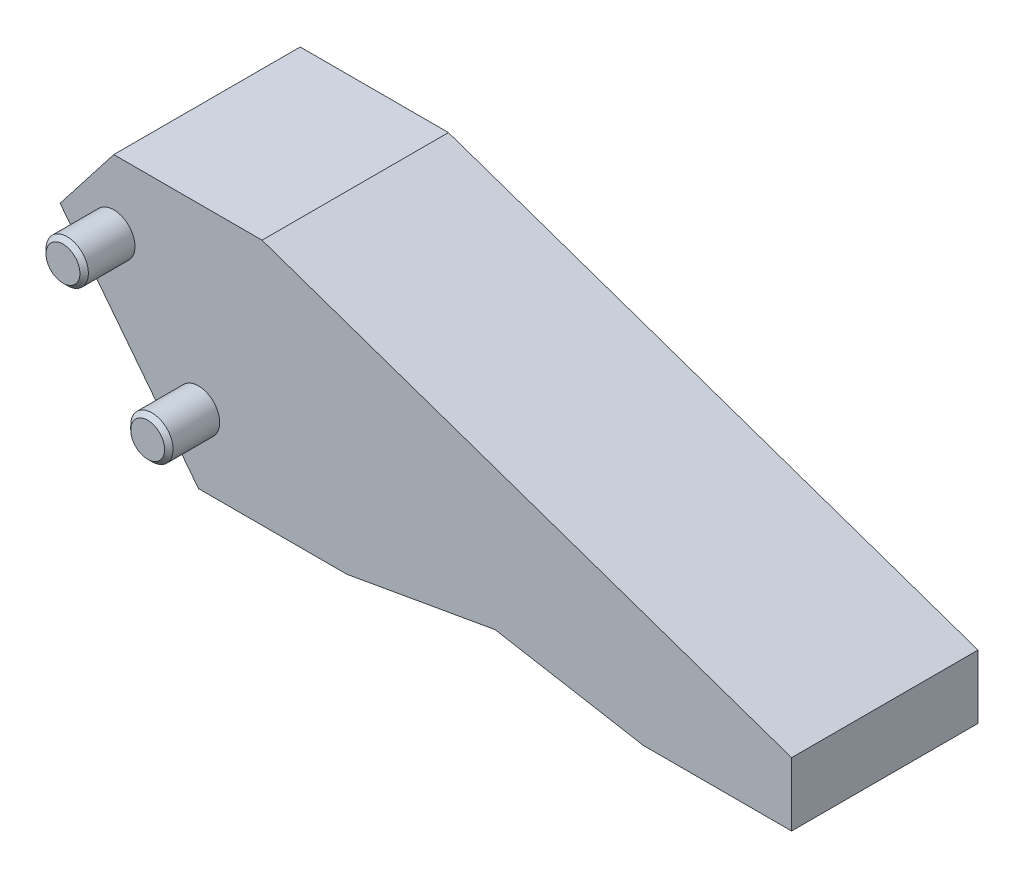
ISO-10303-21;
HEADER;
FILE_DESCRIPTION(('STEP AP214'),'2;1');
FILE_NAME('part.step','',(''),(''),'','','');
FILE_SCHEMA(('AUTOMOTIVE_DESIGN { 1 0 10303 214 1 1 1 1 }'));
ENDSEC;
DATA;
#1=APPLICATION_CONTEXT('core data for automotive mechanical design processes');
#2=APPLICATION_PROTOCOL_DEFINITION('international standard','automotive_design',2000,#1);
#3=PRODUCT_CONTEXT('',#1,'mechanical');
#4=PRODUCT('Part','Part','',(#3));
#5=PRODUCT_RELATED_PRODUCT_CATEGORY('part','',(#4));
#6=PRODUCT_DEFINITION_FORMATION('','',#4);
#7=PRODUCT_DEFINITION_CONTEXT('part definition',#1,'design');
#8=PRODUCT_DEFINITION('design','',#6,#7);
#9=PRODUCT_DEFINITION_SHAPE('','',#8);
#10=(LENGTH_UNIT() NAMED_UNIT(*) SI_UNIT(.MILLI.,.METRE.));
#11=(NAMED_UNIT(*) PLANE_ANGLE_UNIT() SI_UNIT($,.RADIAN.));
#12=(NAMED_UNIT(*) SI_UNIT($,.STERADIAN.) SOLID_ANGLE_UNIT());
#13=UNCERTAINTY_MEASURE_WITH_UNIT(LENGTH_MEASURE(1.E-05),#10,'distance_accuracy_value','');
#14=(GEOMETRIC_REPRESENTATION_CONTEXT(3) GLOBAL_UNCERTAINTY_ASSIGNED_CONTEXT((#13)) GLOBAL_UNIT_ASSIGNED_CONTEXT((#10,
#11,#12)) REPRESENTATION_CONTEXT('',''));
#15=CARTESIAN_POINT('',(0.,0.,0.));
#16=DIRECTION('',(0.,0.,1.));
#17=DIRECTION('',(1.,0.,0.));
#18=AXIS2_PLACEMENT_3D('',#15,#16,#17);
#19=CARTESIAN_POINT('',(-12.6689495444044,0.,22.));
#20=DIRECTION('',(0.,0.,1.));
#21=DIRECTION('',(1.,0.,0.));
#22=AXIS2_PLACEMENT_3D('',#19,#20,#21);
#23=PLANE('',#22);
#24=CARTESIAN_POINT('',(0.,0.,22.));
#25=DIRECTION('',(0.,0.,1.));
#26=DIRECTION('',(1.,0.,0.));
#27=AXIS2_PLACEMENT_3D('',#24,#25,#26);
#28=CIRCLE('',#27,5.);
#29=CARTESIAN_POINT('',(5.,0.,22.));
#30=VERTEX_POINT('',#29);
#31=EDGE_CURVE('E128',#30,#30,#28,.T.);
#32=ORIENTED_EDGE('',*,*,#31,.F.);
#33=EDGE_LOOP('',(#32));
#34=FACE_BOUND('',#33,.T.);
#35=DIRECTION('',(-0.613967345345676,-0.789331425225921,0.));
#36=VECTOR('',#35,1.);
#37=CARTESIAN_POINT('',(-12.6689495444044,0.,22.));
#38=LINE('',#37,#36);
#39=CARTESIAN_POINT('',(0.,16.2875111776015,22.));
#40=VERTEX_POINT('',#39);
#41=CARTESIAN_POINT('',(-12.6689495444044,0.,22.));
#42=VERTEX_POINT('',#41);
#43=EDGE_CURVE('E148',#40,#42,#38,.T.);
#44=ORIENTED_EDGE('',*,*,#43,.T.);
#45=DIRECTION('',(0.613967345345677,-0.78933142522592,0.));
#46=VECTOR('',#45,1.);
#47=CARTESIAN_POINT('',(20.,-42.,22.));
#48=LINE('',#47,#46);
#49=CARTESIAN_POINT('',(20.,-42.,22.));
#50=VERTEX_POINT('',#49);
#51=EDGE_CURVE('E120',#42,#50,#48,.T.);
#52=ORIENTED_EDGE('',*,*,#51,.T.);
#53=DIRECTION('',(1.,0.,0.));
#54=VECTOR('',#53,1.);
#55=CARTESIAN_POINT('',(55.,-42.,22.));
#56=LINE('',#55,#54);
#57=CARTESIAN_POINT('',(55.,-42.,22.));
#58=VERTEX_POINT('',#57);
#59=EDGE_CURVE('E151',#50,#58,#56,.T.);
#60=ORIENTED_EDGE('',*,*,#59,.T.);
#61=DIRECTION('',(0.984807753012208,0.173648177666931,0.));
#62=VECTOR('',#61,1.);
#63=CARTESIAN_POINT('',(90.,-35.8285556752037,22.));
#64=LINE('',#63,#62);
#65=CARTESIAN_POINT('',(90.,-35.8285556752037,22.));
#66=VERTEX_POINT('',#65);
#67=EDGE_CURVE('E153',#58,#66,#64,.T.);
#68=ORIENTED_EDGE('',*,*,#67,.T.);
#69=DIRECTION('',(0.984807753012208,-0.173648177666931,0.));
#70=VECTOR('',#69,1.);
#71=CARTESIAN_POINT('',(125.,-42.,22.));
#72=LINE('',#71,#70);
#73=CARTESIAN_POINT('',(125.,-42.,22.));
#74=VERTEX_POINT('',#73);
#75=EDGE_CURVE('E155',#66,#74,#72,.T.);
#76=ORIENTED_EDGE('',*,*,#75,.T.);
#77=DIRECTION('',(1.,0.,0.));
#78=VECTOR('',#77,1.);
#79=CARTESIAN_POINT('',(160.,-42.,22.));
#80=LINE('',#79,#78);
#81=CARTESIAN_POINT('',(160.,-42.,22.));
#82=VERTEX_POINT('',#81);
#83=EDGE_CURVE('E157',#74,#82,#80,.T.);
#84=ORIENTED_EDGE('',*,*,#83,.T.);
#85=DIRECTION('',(0.,1.,0.));
#86=VECTOR('',#85,1.);
#87=CARTESIAN_POINT('',(160.,-27.,22.));
#88=LINE('',#87,#86);
#89=CARTESIAN_POINT('',(160.,-27.,22.));
#90=VERTEX_POINT('',#89);
#91=EDGE_CURVE('E159',#82,#90,#88,.T.);
#92=ORIENTED_EDGE('',*,*,#91,.T.);
#93=DIRECTION('',(-0.944943348295466,0.327233966012321,0.));
#94=VECTOR('',#93,1.);
#95=CARTESIAN_POINT('',(35.,16.2875111776015,22.));
#96=LINE('',#95,#94);
#97=CARTESIAN_POINT('',(35.,16.2875111776015,22.));
#98=VERTEX_POINT('',#97);
#99=EDGE_CURVE('E53',#90,#98,#96,.T.);
#100=ORIENTED_EDGE('',*,*,#99,.T.);
#101=DIRECTION('',(-1.,0.,0.));
#102=VECTOR('',#101,1.);
#103=CARTESIAN_POINT('',(0.,16.2875111776015,22.));
#104=LINE('',#103,#102);
#105=EDGE_CURVE('E48',#98,#40,#104,.T.);
#106=ORIENTED_EDGE('',*,*,#105,.T.);
#107=EDGE_LOOP('',(#44,#52,#60,#68,#76,#84,#92,#100,#106));
#108=FACE_BOUND('',#107,.T.);
#109=CARTESIAN_POINT('',(20.,-26.,22.));
#110=DIRECTION('',(0.,0.,1.));
#111=DIRECTION('',(1.,0.,0.));
#112=AXIS2_PLACEMENT_3D('',#109,#110,#111);
#113=CIRCLE('',#112,5.);
#114=CARTESIAN_POINT('',(25.,-26.,22.));
#115=VERTEX_POINT('',#114);
#116=EDGE_CURVE('E131',#115,#115,#113,.T.);
#117=ORIENTED_EDGE('',*,*,#116,.F.);
#118=EDGE_LOOP('',(#117));
#119=FACE_BOUND('',#118,.T.);
#120=ADVANCED_FACE('F33',(#34,#108,#119),#23,.T.);
#121=CARTESIAN_POINT('',(-12.6689495444044,0.,-22.));
#122=DIRECTION('',(0.,0.,1.));
#123=DIRECTION('',(1.,0.,0.));
#124=AXIS2_PLACEMENT_3D('',#121,#122,#123);
#125=PLANE('',#124);
#126=CARTESIAN_POINT('',(0.,0.,-22.));
#127=DIRECTION('',(0.,0.,1.));
#128=DIRECTION('',(1.,0.,0.));
#129=AXIS2_PLACEMENT_3D('',#126,#127,#128);
#130=CIRCLE('',#129,5.);
#131=CARTESIAN_POINT('',(5.,0.,-22.));
#132=VERTEX_POINT('',#131);
#133=EDGE_CURVE('E434',#132,#132,#130,.F.);
#134=ORIENTED_EDGE('',*,*,#133,.F.);
#135=EDGE_LOOP('',(#134));
#136=FACE_BOUND('',#135,.T.);
#137=DIRECTION('',(-0.613967345345676,-0.789331425225921,0.));
#138=VECTOR('',#137,1.);
#139=CARTESIAN_POINT('',(-12.6689495444044,0.,-22.));
#140=LINE('',#139,#138);
#141=CARTESIAN_POINT('',(0.,16.2875111776015,-22.));
#142=VERTEX_POINT('',#141);
#143=CARTESIAN_POINT('',(-12.6689495444044,0.,-22.));
#144=VERTEX_POINT('',#143);
#145=EDGE_CURVE('E110',#142,#144,#140,.T.);
#146=ORIENTED_EDGE('',*,*,#145,.F.);
#147=DIRECTION('',(-1.,0.,0.));
#148=VECTOR('',#147,1.);
#149=CARTESIAN_POINT('',(0.,16.2875111776015,-22.));
#150=LINE('',#149,#148);
#151=CARTESIAN_POINT('',(35.,16.2875111776015,-22.));
#152=VERTEX_POINT('',#151);
#153=EDGE_CURVE('E146',#152,#142,#150,.T.);
#154=ORIENTED_EDGE('',*,*,#153,.F.);
#155=DIRECTION('',(-0.944943348295466,0.327233966012321,0.));
#156=VECTOR('',#155,1.);
#157=CARTESIAN_POINT('',(35.,16.2875111776015,-22.));
#158=LINE('',#157,#156);
#159=CARTESIAN_POINT('',(160.,-27.,-22.));
#160=VERTEX_POINT('',#159);
#161=EDGE_CURVE('E144',#160,#152,#158,.T.);
#162=ORIENTED_EDGE('',*,*,#161,.F.);
#163=DIRECTION('',(0.,1.,0.));
#164=VECTOR('',#163,1.);
#165=CARTESIAN_POINT('',(160.,-27.,-22.));
#166=LINE('',#165,#164);
#167=CARTESIAN_POINT('',(160.,-42.,-22.));
#168=VERTEX_POINT('',#167);
#169=EDGE_CURVE('E142',#168,#160,#166,.T.);
#170=ORIENTED_EDGE('',*,*,#169,.F.);
#171=DIRECTION('',(1.,0.,0.));
#172=VECTOR('',#171,1.);
#173=CARTESIAN_POINT('',(160.,-42.,-22.));
#174=LINE('',#173,#172);
#175=CARTESIAN_POINT('',(125.,-42.,-22.));
#176=VERTEX_POINT('',#175);
#177=EDGE_CURVE('E140',#176,#168,#174,.T.);
#178=ORIENTED_EDGE('',*,*,#177,.F.);
#179=DIRECTION('',(0.984807753012208,-0.173648177666931,0.));
#180=VECTOR('',#179,1.);
#181=CARTESIAN_POINT('',(125.,-42.,-22.));
#182=LINE('',#181,#180);
#183=CARTESIAN_POINT('',(90.,-35.8285556752037,-22.));
#184=VERTEX_POINT('',#183);
#185=EDGE_CURVE('E138',#184,#176,#182,.T.);
#186=ORIENTED_EDGE('',*,*,#185,.F.);
#187=DIRECTION('',(0.984807753012208,0.173648177666931,0.));
#188=VECTOR('',#187,1.);
#189=CARTESIAN_POINT('',(90.,-35.8285556752037,-22.));
#190=LINE('',#189,#188);
#191=CARTESIAN_POINT('',(55.,-42.,-22.));
#192=VERTEX_POINT('',#191);
#193=EDGE_CURVE('E136',#192,#184,#190,.T.);
#194=ORIENTED_EDGE('',*,*,#193,.F.);
#195=DIRECTION('',(1.,0.,0.));
#196=VECTOR('',#195,1.);
#197=CARTESIAN_POINT('',(55.,-42.,-22.));
#198=LINE('',#197,#196);
#199=CARTESIAN_POINT('',(20.,-42.,-22.));
#200=VERTEX_POINT('',#199);
#201=EDGE_CURVE('E112',#200,#192,#198,.T.);
#202=ORIENTED_EDGE('',*,*,#201,.F.);
#203=DIRECTION('',(0.613967345345677,-0.78933142522592,0.));
#204=VECTOR('',#203,1.);
#205=CARTESIAN_POINT('',(20.,-42.,-22.));
#206=LINE('',#205,#204);
#207=EDGE_CURVE('E104',#144,#200,#206,.T.);
#208=ORIENTED_EDGE('',*,*,#207,.F.);
#209=EDGE_LOOP('',(#146,#154,#162,#170,#178,#186,#194,#202,#208));
#210=FACE_BOUND('',#209,.T.);
#211=CARTESIAN_POINT('',(20.,-26.,-22.));
#212=DIRECTION('',(0.,0.,1.));
#213=DIRECTION('',(1.,0.,0.));
#214=AXIS2_PLACEMENT_3D('',#211,#212,#213);
#215=CIRCLE('',#214,5.);
#216=CARTESIAN_POINT('',(25.,-26.,-22.));
#217=VERTEX_POINT('',#216);
#218=EDGE_CURVE('E432',#217,#217,#215,.F.);
#219=ORIENTED_EDGE('',*,*,#218,.F.);
#220=EDGE_LOOP('',(#219));
#221=FACE_BOUND('',#220,.T.);
#222=ADVANCED_FACE('F106',(#136,#210,#221),#125,.F.);
#223=CARTESIAN_POINT('',(-12.6689495444044,0.,22.));
#224=DIRECTION('',(0.789331425225921,-0.613967345345676,0.));
#225=DIRECTION('',(0.613967345345676,0.789331425225921,0.));
#226=AXIS2_PLACEMENT_3D('',#223,#224,#225);
#227=PLANE('',#226);
#228=ORIENTED_EDGE('',*,*,#145,.T.);
#229=DIRECTION('',(0.,0.,-1.));
#230=VECTOR('',#229,1.);
#231=CARTESIAN_POINT('',(-12.6689495444044,0.,22.));
#232=LINE('',#231,#230);
#233=EDGE_CURVE('E118',#42,#144,#232,.T.);
#234=ORIENTED_EDGE('',*,*,#233,.F.);
#235=ORIENTED_EDGE('',*,*,#43,.F.);
#236=DIRECTION('',(0.,0.,-1.));
#237=VECTOR('',#236,1.);
#238=CARTESIAN_POINT('',(0.,16.2875111776015,22.));
#239=LINE('',#238,#237);
#240=EDGE_CURVE('E127',#40,#142,#239,.T.);
#241=ORIENTED_EDGE('',*,*,#240,.T.);
#242=EDGE_LOOP('',(#228,#234,#235,#241));
#243=FACE_BOUND('',#242,.T.);
#244=ADVANCED_FACE('F35',(#243),#227,.F.);
#245=CARTESIAN_POINT('',(20.,-42.,22.));
#246=DIRECTION('',(0.78933142522592,0.613967345345677,0.));
#247=DIRECTION('',(-0.613967345345677,0.78933142522592,0.));
#248=AXIS2_PLACEMENT_3D('',#245,#246,#247);
#249=PLANE('',#248);
#250=ORIENTED_EDGE('',*,*,#207,.T.);
#251=DIRECTION('',(0.,0.,-1.));
#252=VECTOR('',#251,1.);
#253=CARTESIAN_POINT('',(20.,-42.,22.));
#254=LINE('',#253,#252);
#255=EDGE_CURVE('E124',#50,#200,#254,.T.);
#256=ORIENTED_EDGE('',*,*,#255,.F.);
#257=ORIENTED_EDGE('',*,*,#51,.F.);
#258=ORIENTED_EDGE('',*,*,#233,.T.);
#259=EDGE_LOOP('',(#250,#256,#257,#258));
#260=FACE_BOUND('',#259,.T.);
#261=ADVANCED_FACE('F119',(#260),#249,.F.);
#262=CARTESIAN_POINT('',(55.,-42.,22.));
#263=DIRECTION('',(0.,1.,0.));
#264=DIRECTION('',(-1.,0.,0.));
#265=AXIS2_PLACEMENT_3D('',#262,#263,#264);
#266=PLANE('',#265);
#267=ORIENTED_EDGE('',*,*,#201,.T.);
#268=DIRECTION('',(0.,0.,-1.));
#269=VECTOR('',#268,1.);
#270=CARTESIAN_POINT('',(55.,-42.,22.));
#271=LINE('',#270,#269);
#272=EDGE_CURVE('E179',#58,#192,#271,.T.);
#273=ORIENTED_EDGE('',*,*,#272,.F.);
#274=ORIENTED_EDGE('',*,*,#59,.F.);
#275=ORIENTED_EDGE('',*,*,#255,.T.);
#276=EDGE_LOOP('',(#267,#273,#274,#275));
#277=FACE_BOUND('',#276,.T.);
#278=ADVANCED_FACE('F252',(#277),#266,.F.);
#279=CARTESIAN_POINT('',(90.,-35.8285556752037,22.));
#280=DIRECTION('',(-0.173648177666931,0.984807753012208,0.));
#281=DIRECTION('',(-0.984807753012208,-0.173648177666931,0.));
#282=AXIS2_PLACEMENT_3D('',#279,#280,#281);
#283=PLANE('',#282);
#284=ORIENTED_EDGE('',*,*,#193,.T.);
#285=DIRECTION('',(0.,0.,-1.));
#286=VECTOR('',#285,1.);
#287=CARTESIAN_POINT('',(90.,-35.8285556752037,22.));
#288=LINE('',#287,#286);
#289=EDGE_CURVE('E176',#66,#184,#288,.T.);
#290=ORIENTED_EDGE('',*,*,#289,.F.);
#291=ORIENTED_EDGE('',*,*,#67,.F.);
#292=ORIENTED_EDGE('',*,*,#272,.T.);
#293=EDGE_LOOP('',(#284,#290,#291,#292));
#294=FACE_BOUND('',#293,.T.);
#295=ADVANCED_FACE('F248',(#294),#283,.F.);
#296=CARTESIAN_POINT('',(125.,-42.,22.));
#297=DIRECTION('',(0.173648177666931,0.984807753012208,0.));
#298=DIRECTION('',(-0.984807753012208,0.173648177666931,0.));
#299=AXIS2_PLACEMENT_3D('',#296,#297,#298);
#300=PLANE('',#299);
#301=ORIENTED_EDGE('',*,*,#185,.T.);
#302=DIRECTION('',(0.,0.,-1.));
#303=VECTOR('',#302,1.);
#304=CARTESIAN_POINT('',(125.,-42.,22.));
#305=LINE('',#304,#303);
#306=EDGE_CURVE('E173',#74,#176,#305,.T.);
#307=ORIENTED_EDGE('',*,*,#306,.F.);
#308=ORIENTED_EDGE('',*,*,#75,.F.);
#309=ORIENTED_EDGE('',*,*,#289,.T.);
#310=EDGE_LOOP('',(#301,#307,#308,#309));
#311=FACE_BOUND('',#310,.T.);
#312=ADVANCED_FACE('F244',(#311),#300,.F.);
#313=CARTESIAN_POINT('',(160.,-42.,22.));
#314=DIRECTION('',(0.,1.,0.));
#315=DIRECTION('',(0.,0.,1.));
#316=AXIS2_PLACEMENT_3D('',#313,#314,#315);
#317=PLANE('',#316);
#318=ORIENTED_EDGE('',*,*,#177,.T.);
#319=DIRECTION('',(0.,0.,-1.));
#320=VECTOR('',#319,1.);
#321=CARTESIAN_POINT('',(160.,-42.,22.));
#322=LINE('',#321,#320);
#323=EDGE_CURVE('E170',#82,#168,#322,.T.);
#324=ORIENTED_EDGE('',*,*,#323,.F.);
#325=ORIENTED_EDGE('',*,*,#83,.F.);
#326=ORIENTED_EDGE('',*,*,#306,.T.);
#327=EDGE_LOOP('',(#318,#324,#325,#326));
#328=FACE_BOUND('',#327,.T.);
#329=ADVANCED_FACE('F240',(#328),#317,.F.);
#330=CARTESIAN_POINT('',(160.,-27.,22.));
#331=DIRECTION('',(-1.,0.,0.));
#332=DIRECTION('',(0.,0.,1.));
#333=AXIS2_PLACEMENT_3D('',#330,#331,#332);
#334=PLANE('',#333);
#335=ORIENTED_EDGE('',*,*,#169,.T.);
#336=DIRECTION('',(0.,0.,-1.));
#337=VECTOR('',#336,1.);
#338=CARTESIAN_POINT('',(160.,-27.,22.));
#339=LINE('',#338,#337);
#340=EDGE_CURVE('E167',#90,#160,#339,.T.);
#341=ORIENTED_EDGE('',*,*,#340,.F.);
#342=ORIENTED_EDGE('',*,*,#91,.F.);
#343=ORIENTED_EDGE('',*,*,#323,.T.);
#344=EDGE_LOOP('',(#335,#341,#342,#343));
#345=FACE_BOUND('',#344,.T.);
#346=ADVANCED_FACE('F236',(#345),#334,.F.);
#347=CARTESIAN_POINT('',(35.,16.2875111776015,22.));
#348=DIRECTION('',(-0.327233966012321,-0.944943348295466,0.));
#349=DIRECTION('',(0.944943348295466,-0.327233966012321,0.));
#350=AXIS2_PLACEMENT_3D('',#347,#348,#349);
#351=PLANE('',#350);
#352=ORIENTED_EDGE('',*,*,#161,.T.);
#353=DIRECTION('',(0.,0.,-1.));
#354=VECTOR('',#353,1.);
#355=CARTESIAN_POINT('',(35.,16.2875111776015,22.));
#356=LINE('',#355,#354);
#357=EDGE_CURVE('E164',#98,#152,#356,.T.);
#358=ORIENTED_EDGE('',*,*,#357,.F.);
#359=ORIENTED_EDGE('',*,*,#99,.F.);
#360=ORIENTED_EDGE('',*,*,#340,.T.);
#361=EDGE_LOOP('',(#352,#358,#359,#360));
#362=FACE_BOUND('',#361,.T.);
#363=ADVANCED_FACE('F232',(#362),#351,.F.);
#364=CARTESIAN_POINT('',(0.,16.2875111776015,22.));
#365=DIRECTION('',(0.,-1.,0.));
#366=DIRECTION('',(1.,0.,0.));
#367=AXIS2_PLACEMENT_3D('',#364,#365,#366);
#368=PLANE('',#367);
#369=ORIENTED_EDGE('',*,*,#153,.T.);
#370=ORIENTED_EDGE('',*,*,#240,.F.);
#371=ORIENTED_EDGE('',*,*,#105,.F.);
#372=ORIENTED_EDGE('',*,*,#357,.T.);
#373=EDGE_LOOP('',(#369,#370,#371,#372));
#374=FACE_BOUND('',#373,.T.);
#375=ADVANCED_FACE('F228',(#374),#368,.F.);
#376=CARTESIAN_POINT('',(20.,-26.,-34.));
#377=DIRECTION('',(0.,0.,1.));
#378=DIRECTION('',(1.,0.,0.));
#379=AXIS2_PLACEMENT_3D('',#376,#377,#378);
#380=PLANE('',#379);
#381=CARTESIAN_POINT('',(20.,-26.,-34.));
#382=DIRECTION('',(0.,0.,1.));
#383=DIRECTION('',(1.,0.,0.));
#384=AXIS2_PLACEMENT_3D('',#381,#382,#383);
#385=CIRCLE('',#384,3.99999999999999);
#386=CARTESIAN_POINT('',(24.,-26.,-34.));
#387=VERTEX_POINT('',#386);
#388=EDGE_CURVE('E11',#387,#387,#385,.F.);
#389=ORIENTED_EDGE('',*,*,#388,.T.);
#390=EDGE_LOOP('',(#389));
#391=FACE_BOUND('',#390,.T.);
#392=ADVANCED_FACE('F231',(#391),#380,.F.);
#393=CARTESIAN_POINT('',(20.,-26.,34.));
#394=DIRECTION('',(0.,0.,-1.));
#395=DIRECTION('',(-1.,0.,0.));
#396=AXIS2_PLACEMENT_3D('',#393,#394,#395);
#397=CYLINDRICAL_SURFACE('',#396,5.);
#398=CARTESIAN_POINT('',(20.,-26.,-33.));
#399=DIRECTION('',(0.,0.,1.));
#400=DIRECTION('',(1.,0.,0.));
#401=AXIS2_PLACEMENT_3D('',#398,#399,#400);
#402=CIRCLE('',#401,5.);
#403=CARTESIAN_POINT('',(25.,-26.,-33.));
#404=VERTEX_POINT('',#403);
#405=EDGE_CURVE('E41',#404,#404,#402,.T.);
#406=ORIENTED_EDGE('',*,*,#405,.T.);
#407=EDGE_LOOP('',(#406));
#408=FACE_BOUND('',#407,.T.);
#409=ORIENTED_EDGE('',*,*,#218,.T.);
#410=EDGE_LOOP('',(#409));
#411=FACE_BOUND('',#410,.T.);
#412=ADVANCED_FACE('F202',(#408,#411),#397,.T.);
#413=CARTESIAN_POINT('',(20.,-26.,33.));
#414=DIRECTION('',(0.,0.,1.));
#415=DIRECTION('',(1.,0.,0.));
#416=AXIS2_PLACEMENT_3D('',#413,#414,#415);
#417=CIRCLE('',#416,5.);
#418=CARTESIAN_POINT('',(25.,-26.,33.));
#419=VERTEX_POINT('',#418);
#420=EDGE_CURVE('E191',#419,#419,#417,.F.);
#421=ORIENTED_EDGE('',*,*,#420,.T.);
#422=EDGE_LOOP('',(#421));
#423=FACE_BOUND('',#422,.T.);
#424=ORIENTED_EDGE('',*,*,#116,.T.);
#425=EDGE_LOOP('',(#424));
#426=FACE_BOUND('',#425,.T.);
#427=ADVANCED_FACE('F329',(#423,#426),#397,.T.);
#428=CARTESIAN_POINT('',(20.,-26.,34.));
#429=DIRECTION('',(0.,0.,1.));
#430=DIRECTION('',(1.,0.,0.));
#431=AXIS2_PLACEMENT_3D('',#428,#429,#430);
#432=PLANE('',#431);
#433=CARTESIAN_POINT('',(20.,-26.,34.));
#434=DIRECTION('',(0.,0.,1.));
#435=DIRECTION('',(1.,0.,0.));
#436=AXIS2_PLACEMENT_3D('',#433,#434,#435);
#437=CIRCLE('',#436,3.99999999999998);
#438=CARTESIAN_POINT('',(24.,-26.,34.));
#439=VERTEX_POINT('',#438);
#440=EDGE_CURVE('E188',#439,#439,#437,.T.);
#441=ORIENTED_EDGE('',*,*,#440,.T.);
#442=EDGE_LOOP('',(#441));
#443=FACE_BOUND('',#442,.T.);
#444=ADVANCED_FACE('F336',(#443),#432,.T.);
#445=CARTESIAN_POINT('',(0.,0.,-34.));
#446=DIRECTION('',(0.,0.,1.));
#447=DIRECTION('',(1.,0.,0.));
#448=AXIS2_PLACEMENT_3D('',#445,#446,#447);
#449=PLANE('',#448);
#450=CARTESIAN_POINT('',(0.,0.,-34.));
#451=DIRECTION('',(0.,0.,1.));
#452=DIRECTION('',(1.,0.,0.));
#453=AXIS2_PLACEMENT_3D('',#450,#451,#452);
#454=CIRCLE('',#453,3.99999999999999);
#455=CARTESIAN_POINT('',(3.99999999999999,0.,-34.));
#456=VERTEX_POINT('',#455);
#457=EDGE_CURVE('E197',#456,#456,#454,.F.);
#458=ORIENTED_EDGE('',*,*,#457,.T.);
#459=EDGE_LOOP('',(#458));
#460=FACE_BOUND('',#459,.T.);
#461=ADVANCED_FACE('F344',(#460),#449,.F.);
#462=CARTESIAN_POINT('',(0.,0.,34.));
#463=DIRECTION('',(0.,0.,-1.));
#464=DIRECTION('',(-1.,0.,0.));
#465=AXIS2_PLACEMENT_3D('',#462,#463,#464);
#466=CYLINDRICAL_SURFACE('',#465,5.);
#467=CARTESIAN_POINT('',(0.,0.,-33.));
#468=DIRECTION('',(0.,0.,1.));
#469=DIRECTION('',(1.,0.,0.));
#470=AXIS2_PLACEMENT_3D('',#467,#468,#469);
#471=CIRCLE('',#470,5.);
#472=CARTESIAN_POINT('',(5.,0.,-33.));
#473=VERTEX_POINT('',#472);
#474=EDGE_CURVE('E194',#473,#473,#471,.T.);
#475=ORIENTED_EDGE('',*,*,#474,.T.);
#476=EDGE_LOOP('',(#475));
#477=FACE_BOUND('',#476,.T.);
#478=ORIENTED_EDGE('',*,*,#133,.T.);
#479=EDGE_LOOP('',(#478));
#480=FACE_BOUND('',#479,.T.);
#481=ADVANCED_FACE('F353',(#477,#480),#466,.T.);
#482=CARTESIAN_POINT('',(0.,0.,33.));
#483=DIRECTION('',(0.,0.,1.));
#484=DIRECTION('',(1.,0.,0.));
#485=AXIS2_PLACEMENT_3D('',#482,#483,#484);
#486=CIRCLE('',#485,5.);
#487=CARTESIAN_POINT('',(5.,0.,33.));
#488=VERTEX_POINT('',#487);
#489=EDGE_CURVE('E185',#488,#488,#486,.F.);
#490=ORIENTED_EDGE('',*,*,#489,.T.);
#491=EDGE_LOOP('',(#490));
#492=FACE_BOUND('',#491,.T.);
#493=ORIENTED_EDGE('',*,*,#31,.T.);
#494=EDGE_LOOP('',(#493));
#495=FACE_BOUND('',#494,.T.);
#496=ADVANCED_FACE('F362',(#492,#495),#466,.T.);
#497=CARTESIAN_POINT('',(0.,0.,34.));
#498=DIRECTION('',(0.,0.,1.));
#499=DIRECTION('',(1.,0.,0.));
#500=AXIS2_PLACEMENT_3D('',#497,#498,#499);
#501=PLANE('',#500);
#502=CARTESIAN_POINT('',(0.,0.,34.));
#503=DIRECTION('',(0.,0.,1.));
#504=DIRECTION('',(1.,0.,0.));
#505=AXIS2_PLACEMENT_3D('',#502,#503,#504);
#506=CIRCLE('',#505,3.99999999999998);
#507=CARTESIAN_POINT('',(3.99999999999998,0.,34.));
#508=VERTEX_POINT('',#507);
#509=EDGE_CURVE('E123',#508,#508,#506,.T.);
#510=ORIENTED_EDGE('',*,*,#509,.T.);
#511=EDGE_LOOP('',(#510));
#512=FACE_BOUND('',#511,.T.);
#513=ADVANCED_FACE('F371',(#512),#501,.T.);
#514=CARTESIAN_POINT('',(0.,0.,34.));
#515=DIRECTION('',(0.,0.,-1.));
#516=DIRECTION('',(-1.,0.,0.));
#517=AXIS2_PLACEMENT_3D('',#514,#515,#516);
#518=CONICAL_SURFACE('',#517,3.99999999999998,0.785398163397453);
#519=ORIENTED_EDGE('',*,*,#489,.F.);
#520=EDGE_LOOP('',(#519));
#521=FACE_BOUND('',#520,.T.);
#522=ORIENTED_EDGE('',*,*,#509,.F.);
#523=EDGE_LOOP('',(#522));
#524=FACE_BOUND('',#523,.T.);
#525=ADVANCED_FACE('F379',(#521,#524),#518,.T.);
#526=CARTESIAN_POINT('',(20.,-26.,34.));
#527=DIRECTION('',(0.,0.,-1.));
#528=DIRECTION('',(-1.,0.,0.));
#529=AXIS2_PLACEMENT_3D('',#526,#527,#528);
#530=CONICAL_SURFACE('',#529,3.99999999999998,0.785398163397453);
#531=ORIENTED_EDGE('',*,*,#420,.F.);
#532=EDGE_LOOP('',(#531));
#533=FACE_BOUND('',#532,.T.);
#534=ORIENTED_EDGE('',*,*,#440,.F.);
#535=EDGE_LOOP('',(#534));
#536=FACE_BOUND('',#535,.T.);
#537=ADVANCED_FACE('F213',(#533,#536),#530,.T.);
#538=CARTESIAN_POINT('',(0.,0.,-33.));
#539=DIRECTION('',(0.,0.,1.));
#540=DIRECTION('',(1.,0.,0.));
#541=AXIS2_PLACEMENT_3D('',#538,#539,#540);
#542=CONICAL_SURFACE('',#541,5.,0.785398163397445);
#543=ORIENTED_EDGE('',*,*,#457,.F.);
#544=EDGE_LOOP('',(#543));
#545=FACE_BOUND('',#544,.T.);
#546=ORIENTED_EDGE('',*,*,#474,.F.);
#547=EDGE_LOOP('',(#546));
#548=FACE_BOUND('',#547,.T.);
#549=ADVANCED_FACE('F207',(#545,#548),#542,.T.);
#550=CARTESIAN_POINT('',(20.,-26.,-33.));
#551=DIRECTION('',(0.,0.,1.));
#552=DIRECTION('',(1.,0.,0.));
#553=AXIS2_PLACEMENT_3D('',#550,#551,#552);
#554=CONICAL_SURFACE('',#553,5.,0.785398163397445);
#555=ORIENTED_EDGE('',*,*,#388,.F.);
#556=EDGE_LOOP('',(#555));
#557=FACE_BOUND('',#556,.T.);
#558=ORIENTED_EDGE('',*,*,#405,.F.);
#559=EDGE_LOOP('',(#558));
#560=FACE_BOUND('',#559,.T.);
#561=ADVANCED_FACE('F205',(#557,#560),#554,.T.);
#562=CLOSED_SHELL('',(#120,#222,#244,#261,#278,#295,#312,#329,#346,#363,#375,#392,#412,#427,
#444,#461,#481,#496,#513,#525,#537,#549,#561));
#563=MANIFOLD_SOLID_BREP('B2',#562);
#564=ADVANCED_BREP_SHAPE_REPRESENTATION('',(#18,#563),#14);
#565=SHAPE_DEFINITION_REPRESENTATION(#9,#564);
ENDSEC;
END-ISO-10303-21;
